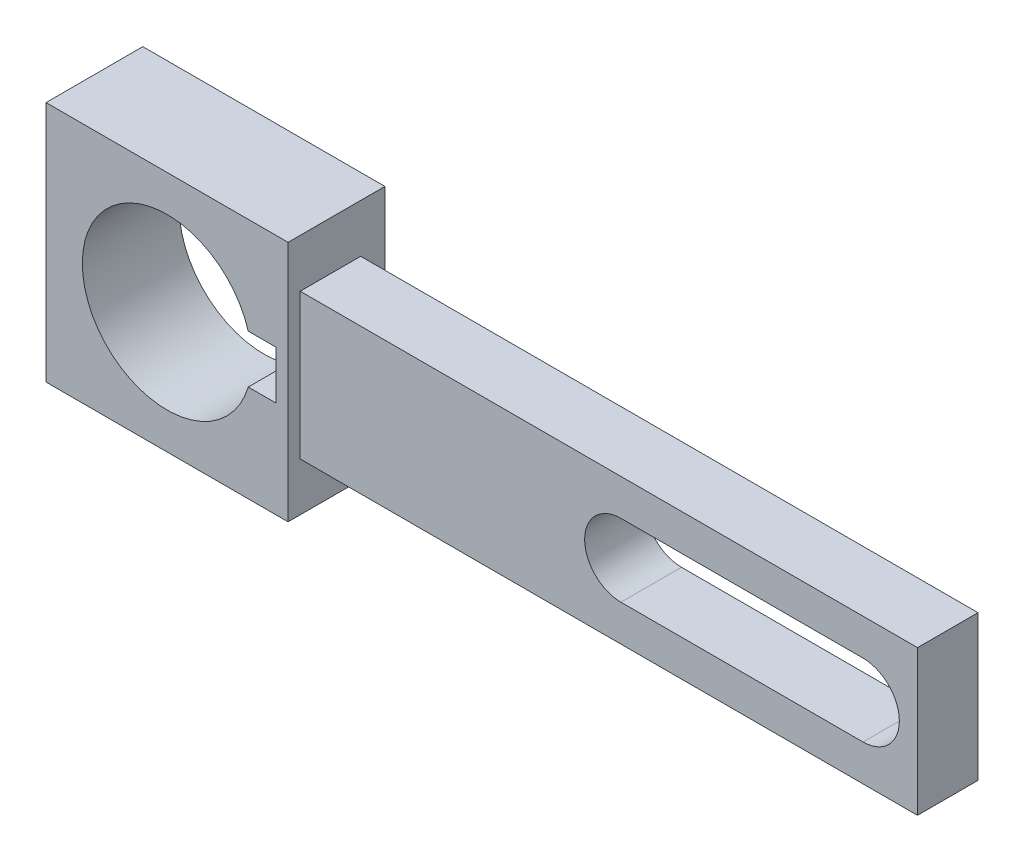
ISO-10303-21;
HEADER;
FILE_DESCRIPTION(('STEP AP214'),'2;1');
FILE_NAME('part.step','',(''),(''),'','','');
FILE_SCHEMA(('AUTOMOTIVE_DESIGN { 1 0 10303 214 1 1 1 1 }'));
ENDSEC;
DATA;
#1=APPLICATION_CONTEXT('core data for automotive mechanical design processes');
#2=APPLICATION_PROTOCOL_DEFINITION('international standard','automotive_design',2000,#1);
#3=PRODUCT_CONTEXT('',#1,'mechanical');
#4=PRODUCT('Part','Part','',(#3));
#5=PRODUCT_RELATED_PRODUCT_CATEGORY('part','',(#4));
#6=PRODUCT_DEFINITION_FORMATION('','',#4);
#7=PRODUCT_DEFINITION_CONTEXT('part definition',#1,'design');
#8=PRODUCT_DEFINITION('design','',#6,#7);
#9=PRODUCT_DEFINITION_SHAPE('','',#8);
#10=(LENGTH_UNIT() NAMED_UNIT(*) SI_UNIT(.MILLI.,.METRE.));
#11=(NAMED_UNIT(*) PLANE_ANGLE_UNIT() SI_UNIT($,.RADIAN.));
#12=(NAMED_UNIT(*) SI_UNIT($,.STERADIAN.) SOLID_ANGLE_UNIT());
#13=UNCERTAINTY_MEASURE_WITH_UNIT(LENGTH_MEASURE(1.E-05),#10,'distance_accuracy_value','');
#14=(GEOMETRIC_REPRESENTATION_CONTEXT(3) GLOBAL_UNCERTAINTY_ASSIGNED_CONTEXT((#13)) GLOBAL_UNIT_ASSIGNED_CONTEXT((#10,
#11,#12)) REPRESENTATION_CONTEXT('',''));
#15=CARTESIAN_POINT('',(0.,0.,0.));
#16=DIRECTION('',(0.,0.,1.));
#17=DIRECTION('',(1.,0.,0.));
#18=AXIS2_PLACEMENT_3D('',#15,#16,#17);
#19=CARTESIAN_POINT('',(10.,-10.,8.));
#20=DIRECTION('',(-1.,0.,0.));
#21=DIRECTION('',(0.,0.,1.));
#22=AXIS2_PLACEMENT_3D('',#19,#20,#21);
#23=PLANE('',#22);
#24=DIRECTION('',(0.,1.,0.));
#25=VECTOR('',#24,1.);
#26=CARTESIAN_POINT('',(10.,-10.,0.));
#27=LINE('',#26,#25);
#28=CARTESIAN_POINT('',(10.,-10.,0.));
#29=VERTEX_POINT('',#28);
#30=CARTESIAN_POINT('',(10.,10.,0.));
#31=VERTEX_POINT('',#30);
#32=EDGE_CURVE('E288',#29,#31,#27,.T.);
#33=ORIENTED_EDGE('',*,*,#32,.T.);
#34=DIRECTION('',(0.,0.,-1.));
#35=VECTOR('',#34,1.);
#36=CARTESIAN_POINT('',(10.,10.,8.));
#37=LINE('',#36,#35);
#38=CARTESIAN_POINT('',(10.,10.,8.));
#39=VERTEX_POINT('',#38);
#40=EDGE_CURVE('E11',#39,#31,#37,.T.);
#41=ORIENTED_EDGE('',*,*,#40,.F.);
#42=DIRECTION('',(0.,1.,0.));
#43=VECTOR('',#42,1.);
#44=CARTESIAN_POINT('',(10.,-10.,8.));
#45=LINE('',#44,#43);
#46=CARTESIAN_POINT('',(10.,-10.,8.));
#47=VERTEX_POINT('',#46);
#48=EDGE_CURVE('E289',#47,#39,#45,.T.);
#49=ORIENTED_EDGE('',*,*,#48,.F.);
#50=DIRECTION('',(0.,0.,-1.));
#51=VECTOR('',#50,1.);
#52=CARTESIAN_POINT('',(10.,-10.,8.));
#53=LINE('',#52,#51);
#54=EDGE_CURVE('E303',#47,#29,#53,.T.);
#55=ORIENTED_EDGE('',*,*,#54,.T.);
#56=EDGE_LOOP('',(#33,#41,#49,#55));
#57=FACE_BOUND('',#56,.T.);
#58=DIRECTION('',(0.,-1.,0.));
#59=VECTOR('',#58,1.);
#60=CARTESIAN_POINT('',(10.,6.,7.));
#61=LINE('',#60,#59);
#62=CARTESIAN_POINT('',(10.,6.,7.));
#63=VERTEX_POINT('',#62);
#64=CARTESIAN_POINT('',(10.,-6.,7.));
#65=VERTEX_POINT('',#64);
#66=EDGE_CURVE('E200',#63,#65,#61,.T.);
#67=ORIENTED_EDGE('',*,*,#66,.F.);
#68=DIRECTION('',(0.,0.,1.));
#69=VECTOR('',#68,1.);
#70=CARTESIAN_POINT('',(10.,6.,7.));
#71=LINE('',#70,#69);
#72=CARTESIAN_POINT('',(10.,6.,2.));
#73=VERTEX_POINT('',#72);
#74=EDGE_CURVE('E206',#73,#63,#71,.T.);
#75=ORIENTED_EDGE('',*,*,#74,.F.);
#76=DIRECTION('',(0.,1.,0.));
#77=VECTOR('',#76,1.);
#78=CARTESIAN_POINT('',(10.,6.,2.));
#79=LINE('',#78,#77);
#80=CARTESIAN_POINT('',(10.,-6.,2.));
#81=VERTEX_POINT('',#80);
#82=EDGE_CURVE('E223',#81,#73,#79,.T.);
#83=ORIENTED_EDGE('',*,*,#82,.F.);
#84=DIRECTION('',(0.,0.,-1.));
#85=VECTOR('',#84,1.);
#86=CARTESIAN_POINT('',(10.,-6.,7.));
#87=LINE('',#86,#85);
#88=EDGE_CURVE('E219',#65,#81,#87,.T.);
#89=ORIENTED_EDGE('',*,*,#88,.F.);
#90=EDGE_LOOP('',(#67,#75,#83,#89));
#91=FACE_BOUND('',#90,.T.);
#92=ADVANCED_FACE('F39',(#57,#91),#23,.F.);
#93=CARTESIAN_POINT('',(0.,0.,8.));
#94=DIRECTION('',(0.,0.,-1.));
#95=DIRECTION('',(-1.,0.,0.));
#96=AXIS2_PLACEMENT_3D('',#93,#94,#95);
#97=PLANE('',#96);
#98=ORIENTED_EDGE('',*,*,#48,.T.);
#99=DIRECTION('',(-1.,0.,0.));
#100=VECTOR('',#99,1.);
#101=CARTESIAN_POINT('',(-10.,10.,8.));
#102=LINE('',#101,#100);
#103=CARTESIAN_POINT('',(-10.,10.,8.));
#104=VERTEX_POINT('',#103);
#105=EDGE_CURVE('E293',#39,#104,#102,.T.);
#106=ORIENTED_EDGE('',*,*,#105,.T.);
#107=DIRECTION('',(0.,-1.,0.));
#108=VECTOR('',#107,1.);
#109=CARTESIAN_POINT('',(-10.,-10.,8.));
#110=LINE('',#109,#108);
#111=CARTESIAN_POINT('',(-10.,-10.,8.));
#112=VERTEX_POINT('',#111);
#113=EDGE_CURVE('E297',#104,#112,#110,.T.);
#114=ORIENTED_EDGE('',*,*,#113,.T.);
#115=DIRECTION('',(1.,0.,0.));
#116=VECTOR('',#115,1.);
#117=CARTESIAN_POINT('',(-10.,-10.,8.));
#118=LINE('',#117,#116);
#119=EDGE_CURVE('E300',#112,#47,#118,.T.);
#120=ORIENTED_EDGE('',*,*,#119,.T.);
#121=EDGE_LOOP('',(#98,#106,#114,#120));
#122=FACE_BOUND('',#121,.T.);
#123=DIRECTION('',(0.,1.,0.));
#124=VECTOR('',#123,1.);
#125=CARTESIAN_POINT('',(9.,-2.,8.));
#126=LINE('',#125,#124);
#127=CARTESIAN_POINT('',(9.,-2.,8.));
#128=VERTEX_POINT('',#127);
#129=CARTESIAN_POINT('',(9.,2.,8.));
#130=VERTEX_POINT('',#129);
#131=EDGE_CURVE('E246',#128,#130,#126,.T.);
#132=ORIENTED_EDGE('',*,*,#131,.F.);
#133=DIRECTION('',(1.,0.,0.));
#134=VECTOR('',#133,1.);
#135=CARTESIAN_POINT('',(6.70820393249936,-2.00000000000002,8.));
#136=LINE('',#135,#134);
#137=CARTESIAN_POINT('',(6.70820393249936,-2.00000000000002,8.));
#138=VERTEX_POINT('',#137);
#139=EDGE_CURVE('E257',#138,#128,#136,.T.);
#140=ORIENTED_EDGE('',*,*,#139,.F.);
#141=CARTESIAN_POINT('',(0.,0.,8.));
#142=DIRECTION('',(0.,0.,1.));
#143=DIRECTION('',(1.,0.,0.));
#144=AXIS2_PLACEMENT_3D('',#141,#142,#143);
#145=CIRCLE('',#144,7.);
#146=CARTESIAN_POINT('',(6.70820393249937,1.99999999999998,8.));
#147=VERTEX_POINT('',#146);
#148=EDGE_CURVE('E253',#147,#138,#145,.T.);
#149=ORIENTED_EDGE('',*,*,#148,.F.);
#150=DIRECTION('',(-1.,0.,0.));
#151=VECTOR('',#150,1.);
#152=CARTESIAN_POINT('',(6.70820393249937,1.99999999999998,8.));
#153=LINE('',#152,#151);
#154=EDGE_CURVE('E249',#130,#147,#153,.T.);
#155=ORIENTED_EDGE('',*,*,#154,.F.);
#156=EDGE_LOOP('',(#132,#140,#149,#155));
#157=FACE_BOUND('',#156,.T.);
#158=ADVANCED_FACE('F344',(#122,#157),#97,.F.);
#159=CARTESIAN_POINT('',(0.,0.,0.));
#160=DIRECTION('',(0.,0.,-1.));
#161=DIRECTION('',(-1.,0.,0.));
#162=AXIS2_PLACEMENT_3D('',#159,#160,#161);
#163=PLANE('',#162);
#164=ORIENTED_EDGE('',*,*,#32,.F.);
#165=DIRECTION('',(1.,0.,0.));
#166=VECTOR('',#165,1.);
#167=CARTESIAN_POINT('',(-10.,-10.,0.));
#168=LINE('',#167,#166);
#169=CARTESIAN_POINT('',(-10.,-10.,0.));
#170=VERTEX_POINT('',#169);
#171=EDGE_CURVE('E294',#170,#29,#168,.T.);
#172=ORIENTED_EDGE('',*,*,#171,.F.);
#173=DIRECTION('',(0.,-1.,0.));
#174=VECTOR('',#173,1.);
#175=CARTESIAN_POINT('',(-10.,-10.,0.));
#176=LINE('',#175,#174);
#177=CARTESIAN_POINT('',(-10.,10.,0.));
#178=VERTEX_POINT('',#177);
#179=EDGE_CURVE('E310',#178,#170,#176,.T.);
#180=ORIENTED_EDGE('',*,*,#179,.F.);
#181=DIRECTION('',(-1.,0.,0.));
#182=VECTOR('',#181,1.);
#183=CARTESIAN_POINT('',(-10.,10.,0.));
#184=LINE('',#183,#182);
#185=EDGE_CURVE('E307',#31,#178,#184,.T.);
#186=ORIENTED_EDGE('',*,*,#185,.F.);
#187=EDGE_LOOP('',(#164,#172,#180,#186));
#188=FACE_BOUND('',#187,.T.);
#189=DIRECTION('',(1.,0.,0.));
#190=VECTOR('',#189,1.);
#191=CARTESIAN_POINT('',(6.70820393249936,-2.00000000000002,0.));
#192=LINE('',#191,#190);
#193=CARTESIAN_POINT('',(6.70820393249936,-2.00000000000002,0.));
#194=VERTEX_POINT('',#193);
#195=CARTESIAN_POINT('',(9.,-2.,0.));
#196=VERTEX_POINT('',#195);
#197=EDGE_CURVE('E250',#194,#196,#192,.T.);
#198=ORIENTED_EDGE('',*,*,#197,.T.);
#199=DIRECTION('',(0.,1.,0.));
#200=VECTOR('',#199,1.);
#201=CARTESIAN_POINT('',(9.,-2.,0.));
#202=LINE('',#201,#200);
#203=CARTESIAN_POINT('',(9.,2.,0.));
#204=VERTEX_POINT('',#203);
#205=EDGE_CURVE('E245',#196,#204,#202,.T.);
#206=ORIENTED_EDGE('',*,*,#205,.T.);
#207=DIRECTION('',(-1.,0.,0.));
#208=VECTOR('',#207,1.);
#209=CARTESIAN_POINT('',(6.70820393249937,1.99999999999998,0.));
#210=LINE('',#209,#208);
#211=CARTESIAN_POINT('',(6.70820393249937,1.99999999999998,0.));
#212=VERTEX_POINT('',#211);
#213=EDGE_CURVE('E264',#204,#212,#210,.T.);
#214=ORIENTED_EDGE('',*,*,#213,.T.);
#215=CARTESIAN_POINT('',(0.,0.,0.));
#216=DIRECTION('',(0.,0.,1.));
#217=DIRECTION('',(1.,0.,0.));
#218=AXIS2_PLACEMENT_3D('',#215,#216,#217);
#219=CIRCLE('',#218,7.);
#220=EDGE_CURVE('E268',#212,#194,#219,.T.);
#221=ORIENTED_EDGE('',*,*,#220,.T.);
#222=EDGE_LOOP('',(#198,#206,#214,#221));
#223=FACE_BOUND('',#222,.T.);
#224=ADVANCED_FACE('F333',(#188,#223),#163,.T.);
#225=CARTESIAN_POINT('',(-10.,10.,8.));
#226=DIRECTION('',(0.,-1.,0.));
#227=DIRECTION('',(0.,0.,-1.));
#228=AXIS2_PLACEMENT_3D('',#225,#226,#227);
#229=PLANE('',#228);
#230=ORIENTED_EDGE('',*,*,#185,.T.);
#231=DIRECTION('',(0.,0.,-1.));
#232=VECTOR('',#231,1.);
#233=CARTESIAN_POINT('',(-10.,10.,8.));
#234=LINE('',#233,#232);
#235=EDGE_CURVE('E47',#104,#178,#234,.T.);
#236=ORIENTED_EDGE('',*,*,#235,.F.);
#237=ORIENTED_EDGE('',*,*,#105,.F.);
#238=ORIENTED_EDGE('',*,*,#40,.T.);
#239=EDGE_LOOP('',(#230,#236,#237,#238));
#240=FACE_BOUND('',#239,.T.);
#241=ADVANCED_FACE('F346',(#240),#229,.F.);
#242=CARTESIAN_POINT('',(-10.,-10.,8.));
#243=DIRECTION('',(1.,0.,0.));
#244=DIRECTION('',(0.,0.,-1.));
#245=AXIS2_PLACEMENT_3D('',#242,#243,#244);
#246=PLANE('',#245);
#247=ORIENTED_EDGE('',*,*,#179,.T.);
#248=DIRECTION('',(0.,0.,-1.));
#249=VECTOR('',#248,1.);
#250=CARTESIAN_POINT('',(-10.,-10.,8.));
#251=LINE('',#250,#249);
#252=EDGE_CURVE('E318',#112,#170,#251,.T.);
#253=ORIENTED_EDGE('',*,*,#252,.F.);
#254=ORIENTED_EDGE('',*,*,#113,.F.);
#255=ORIENTED_EDGE('',*,*,#235,.T.);
#256=EDGE_LOOP('',(#247,#253,#254,#255));
#257=FACE_BOUND('',#256,.T.);
#258=ADVANCED_FACE('F327',(#257),#246,.F.);
#259=CARTESIAN_POINT('',(-10.,-10.,8.));
#260=DIRECTION('',(0.,1.,0.));
#261=DIRECTION('',(0.,0.,1.));
#262=AXIS2_PLACEMENT_3D('',#259,#260,#261);
#263=PLANE('',#262);
#264=ORIENTED_EDGE('',*,*,#171,.T.);
#265=ORIENTED_EDGE('',*,*,#54,.F.);
#266=ORIENTED_EDGE('',*,*,#119,.F.);
#267=ORIENTED_EDGE('',*,*,#252,.T.);
#268=EDGE_LOOP('',(#264,#265,#266,#267));
#269=FACE_BOUND('',#268,.T.);
#270=ADVANCED_FACE('F337',(#269),#263,.F.);
#271=CARTESIAN_POINT('',(9.,-2.,8.));
#272=DIRECTION('',(-1.,0.,0.));
#273=DIRECTION('',(0.,-1.,0.));
#274=AXIS2_PLACEMENT_3D('',#271,#272,#273);
#275=PLANE('',#274);
#276=ORIENTED_EDGE('',*,*,#205,.F.);
#277=DIRECTION('',(0.,0.,-1.));
#278=VECTOR('',#277,1.);
#279=CARTESIAN_POINT('',(9.,-2.,8.));
#280=LINE('',#279,#278);
#281=EDGE_CURVE('E260',#128,#196,#280,.T.);
#282=ORIENTED_EDGE('',*,*,#281,.F.);
#283=ORIENTED_EDGE('',*,*,#131,.T.);
#284=DIRECTION('',(0.,0.,-1.));
#285=VECTOR('',#284,1.);
#286=CARTESIAN_POINT('',(9.,2.,8.));
#287=LINE('',#286,#285);
#288=EDGE_CURVE('E284',#130,#204,#287,.T.);
#289=ORIENTED_EDGE('',*,*,#288,.T.);
#290=EDGE_LOOP('',(#276,#282,#283,#289));
#291=FACE_BOUND('',#290,.T.);
#292=ADVANCED_FACE('F362',(#291),#275,.T.);
#293=CARTESIAN_POINT('',(6.70820393249937,1.99999999999998,8.));
#294=DIRECTION('',(0.,-1.,0.));
#295=DIRECTION('',(1.,0.,0.));
#296=AXIS2_PLACEMENT_3D('',#293,#294,#295);
#297=PLANE('',#296);
#298=ORIENTED_EDGE('',*,*,#213,.F.);
#299=ORIENTED_EDGE('',*,*,#288,.F.);
#300=ORIENTED_EDGE('',*,*,#154,.T.);
#301=DIRECTION('',(0.,0.,-1.));
#302=VECTOR('',#301,1.);
#303=CARTESIAN_POINT('',(6.70820393249937,1.99999999999998,8.));
#304=LINE('',#303,#302);
#305=EDGE_CURVE('E281',#147,#212,#304,.T.);
#306=ORIENTED_EDGE('',*,*,#305,.T.);
#307=EDGE_LOOP('',(#298,#299,#300,#306));
#308=FACE_BOUND('',#307,.T.);
#309=ADVANCED_FACE('F369',(#308),#297,.T.);
#310=CARTESIAN_POINT('',(0.,0.,8.));
#311=DIRECTION('',(0.,0.,-1.));
#312=DIRECTION('',(-1.,0.,0.));
#313=AXIS2_PLACEMENT_3D('',#310,#311,#312);
#314=CYLINDRICAL_SURFACE('',#313,7.);
#315=ORIENTED_EDGE('',*,*,#220,.F.);
#316=ORIENTED_EDGE('',*,*,#305,.F.);
#317=ORIENTED_EDGE('',*,*,#148,.T.);
#318=DIRECTION('',(0.,0.,-1.));
#319=VECTOR('',#318,1.);
#320=CARTESIAN_POINT('',(6.70820393249936,-2.00000000000002,8.));
#321=LINE('',#320,#319);
#322=EDGE_CURVE('E278',#138,#194,#321,.T.);
#323=ORIENTED_EDGE('',*,*,#322,.T.);
#324=EDGE_LOOP('',(#315,#316,#317,#323));
#325=FACE_BOUND('',#324,.T.);
#326=ADVANCED_FACE('F374',(#325),#314,.F.);
#327=CARTESIAN_POINT('',(6.70820393249936,-2.00000000000002,8.));
#328=DIRECTION('',(0.,1.,0.));
#329=DIRECTION('',(-1.,0.,0.));
#330=AXIS2_PLACEMENT_3D('',#327,#328,#329);
#331=PLANE('',#330);
#332=ORIENTED_EDGE('',*,*,#197,.F.);
#333=ORIENTED_EDGE('',*,*,#322,.F.);
#334=ORIENTED_EDGE('',*,*,#139,.T.);
#335=ORIENTED_EDGE('',*,*,#281,.T.);
#336=EDGE_LOOP('',(#332,#333,#334,#335));
#337=FACE_BOUND('',#336,.T.);
#338=ADVANCED_FACE('F381',(#337),#331,.T.);
#339=CARTESIAN_POINT('',(61.,6.,7.));
#340=DIRECTION('',(0.,0.,-1.));
#341=DIRECTION('',(-1.,0.,0.));
#342=AXIS2_PLACEMENT_3D('',#339,#340,#341);
#343=PLANE('',#342);
#344=DIRECTION('',(1.,0.,0.));
#345=VECTOR('',#344,1.);
#346=CARTESIAN_POINT('',(61.,3.,7.));
#347=LINE('',#346,#345);
#348=CARTESIAN_POINT('',(36.5,3.,7.));
#349=VERTEX_POINT('',#348);
#350=CARTESIAN_POINT('',(56.5,3.,7.));
#351=VERTEX_POINT('',#350);
#352=EDGE_CURVE('E192',#349,#351,#347,.T.);
#353=ORIENTED_EDGE('',*,*,#352,.T.);
#354=CARTESIAN_POINT('',(56.5,0.,7.));
#355=DIRECTION('',(0.,0.,-1.));
#356=DIRECTION('',(-1.,0.,0.));
#357=AXIS2_PLACEMENT_3D('',#354,#355,#356);
#358=CIRCLE('',#357,3.);
#359=CARTESIAN_POINT('',(56.5,-3.,7.));
#360=VERTEX_POINT('',#359);
#361=EDGE_CURVE('E196',#351,#360,#358,.T.);
#362=ORIENTED_EDGE('',*,*,#361,.T.);
#363=DIRECTION('',(-1.,0.,0.));
#364=VECTOR('',#363,1.);
#365=CARTESIAN_POINT('',(61.,-3.,7.));
#366=LINE('',#365,#364);
#367=CARTESIAN_POINT('',(36.5,-3.,7.));
#368=VERTEX_POINT('',#367);
#369=EDGE_CURVE('E183',#360,#368,#366,.T.);
#370=ORIENTED_EDGE('',*,*,#369,.T.);
#371=CARTESIAN_POINT('',(36.5,0.,7.));
#372=DIRECTION('',(0.,0.,-1.));
#373=DIRECTION('',(-1.,0.,0.));
#374=AXIS2_PLACEMENT_3D('',#371,#372,#373);
#375=CIRCLE('',#374,3.);
#376=EDGE_CURVE('E158',#368,#349,#375,.T.);
#377=ORIENTED_EDGE('',*,*,#376,.T.);
#378=EDGE_LOOP('',(#353,#362,#370,#377));
#379=FACE_BOUND('',#378,.T.);
#380=ORIENTED_EDGE('',*,*,#66,.T.);
#381=DIRECTION('',(-1.,0.,0.));
#382=VECTOR('',#381,1.);
#383=CARTESIAN_POINT('',(61.,-6.,7.));
#384=LINE('',#383,#382);
#385=CARTESIAN_POINT('',(61.,-6.,7.));
#386=VERTEX_POINT('',#385);
#387=EDGE_CURVE('E241',#386,#65,#384,.T.);
#388=ORIENTED_EDGE('',*,*,#387,.F.);
#389=DIRECTION('',(0.,-1.,0.));
#390=VECTOR('',#389,1.);
#391=CARTESIAN_POINT('',(61.,6.,7.));
#392=LINE('',#391,#390);
#393=CARTESIAN_POINT('',(61.,6.,7.));
#394=VERTEX_POINT('',#393);
#395=EDGE_CURVE('E201',#394,#386,#392,.T.);
#396=ORIENTED_EDGE('',*,*,#395,.F.);
#397=DIRECTION('',(-1.,0.,0.));
#398=VECTOR('',#397,1.);
#399=CARTESIAN_POINT('',(61.,6.,7.));
#400=LINE('',#399,#398);
#401=EDGE_CURVE('E215',#394,#63,#400,.T.);
#402=ORIENTED_EDGE('',*,*,#401,.T.);
#403=EDGE_LOOP('',(#380,#388,#396,#402));
#404=FACE_BOUND('',#403,.T.);
#405=ADVANCED_FACE('F393',(#379,#404),#343,.F.);
#406=CARTESIAN_POINT('',(61.,-6.,7.));
#407=DIRECTION('',(0.,1.,0.));
#408=DIRECTION('',(0.,0.,1.));
#409=AXIS2_PLACEMENT_3D('',#406,#407,#408);
#410=PLANE('',#409);
#411=ORIENTED_EDGE('',*,*,#88,.T.);
#412=DIRECTION('',(-1.,0.,0.));
#413=VECTOR('',#412,1.);
#414=CARTESIAN_POINT('',(61.,-6.,2.));
#415=LINE('',#414,#413);
#416=CARTESIAN_POINT('',(61.,-6.,2.));
#417=VERTEX_POINT('',#416);
#418=EDGE_CURVE('E237',#417,#81,#415,.T.);
#419=ORIENTED_EDGE('',*,*,#418,.F.);
#420=DIRECTION('',(0.,0.,-1.));
#421=VECTOR('',#420,1.);
#422=CARTESIAN_POINT('',(61.,-6.,7.));
#423=LINE('',#422,#421);
#424=EDGE_CURVE('E205',#386,#417,#423,.T.);
#425=ORIENTED_EDGE('',*,*,#424,.F.);
#426=ORIENTED_EDGE('',*,*,#387,.T.);
#427=EDGE_LOOP('',(#411,#419,#425,#426));
#428=FACE_BOUND('',#427,.T.);
#429=ADVANCED_FACE('F398',(#428),#410,.F.);
#430=CARTESIAN_POINT('',(61.,6.,2.));
#431=DIRECTION('',(0.,0.,1.));
#432=DIRECTION('',(1.,0.,0.));
#433=AXIS2_PLACEMENT_3D('',#430,#431,#432);
#434=PLANE('',#433);
#435=DIRECTION('',(-1.,0.,0.));
#436=VECTOR('',#435,1.);
#437=CARTESIAN_POINT('',(56.5,-3.,2.));
#438=LINE('',#437,#436);
#439=CARTESIAN_POINT('',(56.5,-3.,2.));
#440=VERTEX_POINT('',#439);
#441=CARTESIAN_POINT('',(36.5,-3.,2.));
#442=VERTEX_POINT('',#441);
#443=EDGE_CURVE('E165',#440,#442,#438,.T.);
#444=ORIENTED_EDGE('',*,*,#443,.F.);
#445=CARTESIAN_POINT('',(56.5,0.,2.));
#446=DIRECTION('',(0.,0.,-1.));
#447=DIRECTION('',(-1.,0.,0.));
#448=AXIS2_PLACEMENT_3D('',#445,#446,#447);
#449=CIRCLE('',#448,3.);
#450=CARTESIAN_POINT('',(56.5,3.,2.));
#451=VERTEX_POINT('',#450);
#452=EDGE_CURVE('E62',#451,#440,#449,.T.);
#453=ORIENTED_EDGE('',*,*,#452,.F.);
#454=DIRECTION('',(1.,0.,0.));
#455=VECTOR('',#454,1.);
#456=CARTESIAN_POINT('',(56.5,3.,2.));
#457=LINE('',#456,#455);
#458=CARTESIAN_POINT('',(36.5,3.,2.));
#459=VERTEX_POINT('',#458);
#460=EDGE_CURVE('E173',#459,#451,#457,.T.);
#461=ORIENTED_EDGE('',*,*,#460,.F.);
#462=CARTESIAN_POINT('',(36.5,0.,2.));
#463=DIRECTION('',(0.,0.,-1.));
#464=DIRECTION('',(-1.,0.,0.));
#465=AXIS2_PLACEMENT_3D('',#462,#463,#464);
#466=CIRCLE('',#465,3.);
#467=EDGE_CURVE('E155',#442,#459,#466,.T.);
#468=ORIENTED_EDGE('',*,*,#467,.F.);
#469=EDGE_LOOP('',(#444,#453,#461,#468));
#470=FACE_BOUND('',#469,.T.);
#471=ORIENTED_EDGE('',*,*,#82,.T.);
#472=DIRECTION('',(-1.,0.,0.));
#473=VECTOR('',#472,1.);
#474=CARTESIAN_POINT('',(61.,6.,2.));
#475=LINE('',#474,#473);
#476=CARTESIAN_POINT('',(61.,6.,2.));
#477=VERTEX_POINT('',#476);
#478=EDGE_CURVE('E233',#477,#73,#475,.T.);
#479=ORIENTED_EDGE('',*,*,#478,.F.);
#480=DIRECTION('',(0.,1.,0.));
#481=VECTOR('',#480,1.);
#482=CARTESIAN_POINT('',(61.,6.,2.));
#483=LINE('',#482,#481);
#484=EDGE_CURVE('E209',#417,#477,#483,.T.);
#485=ORIENTED_EDGE('',*,*,#484,.F.);
#486=ORIENTED_EDGE('',*,*,#418,.T.);
#487=EDGE_LOOP('',(#471,#479,#485,#486));
#488=FACE_BOUND('',#487,.T.);
#489=ADVANCED_FACE('F170',(#470,#488),#434,.F.);
#490=CARTESIAN_POINT('',(61.,6.,7.));
#491=DIRECTION('',(0.,-1.,0.));
#492=DIRECTION('',(0.,0.,-1.));
#493=AXIS2_PLACEMENT_3D('',#490,#491,#492);
#494=PLANE('',#493);
#495=ORIENTED_EDGE('',*,*,#74,.T.);
#496=ORIENTED_EDGE('',*,*,#401,.F.);
#497=DIRECTION('',(0.,0.,1.));
#498=VECTOR('',#497,1.);
#499=CARTESIAN_POINT('',(61.,6.,7.));
#500=LINE('',#499,#498);
#501=EDGE_CURVE('E212',#477,#394,#500,.T.);
#502=ORIENTED_EDGE('',*,*,#501,.F.);
#503=ORIENTED_EDGE('',*,*,#478,.T.);
#504=EDGE_LOOP('',(#495,#496,#502,#503));
#505=FACE_BOUND('',#504,.T.);
#506=ADVANCED_FACE('F405',(#505),#494,.F.);
#507=CARTESIAN_POINT('',(61.,0.,0.));
#508=DIRECTION('',(1.,0.,0.));
#509=DIRECTION('',(0.,0.,-1.));
#510=AXIS2_PLACEMENT_3D('',#507,#508,#509);
#511=PLANE('',#510);
#512=ORIENTED_EDGE('',*,*,#395,.T.);
#513=ORIENTED_EDGE('',*,*,#424,.T.);
#514=ORIENTED_EDGE('',*,*,#484,.T.);
#515=ORIENTED_EDGE('',*,*,#501,.T.);
#516=EDGE_LOOP('',(#512,#513,#514,#515));
#517=FACE_BOUND('',#516,.T.);
#518=ADVANCED_FACE('F408',(#517),#511,.T.);
#519=CARTESIAN_POINT('',(56.5,0.,8.));
#520=DIRECTION('',(0.,0.,-1.));
#521=DIRECTION('',(-1.,0.,0.));
#522=AXIS2_PLACEMENT_3D('',#519,#520,#521);
#523=CYLINDRICAL_SURFACE('',#522,3.);
#524=DIRECTION('',(0.,0.,-1.));
#525=VECTOR('',#524,1.);
#526=CARTESIAN_POINT('',(56.5,3.,8.));
#527=LINE('',#526,#525);
#528=EDGE_CURVE('E180',#351,#451,#527,.T.);
#529=ORIENTED_EDGE('',*,*,#528,.T.);
#530=ORIENTED_EDGE('',*,*,#452,.T.);
#531=DIRECTION('',(0.,0.,-1.));
#532=VECTOR('',#531,1.);
#533=CARTESIAN_POINT('',(56.5,-3.,8.));
#534=LINE('',#533,#532);
#535=EDGE_CURVE('E162',#360,#440,#534,.T.);
#536=ORIENTED_EDGE('',*,*,#535,.F.);
#537=ORIENTED_EDGE('',*,*,#361,.F.);
#538=EDGE_LOOP('',(#529,#530,#536,#537));
#539=FACE_BOUND('',#538,.T.);
#540=ADVANCED_FACE('F412',(#539),#523,.F.);
#541=CARTESIAN_POINT('',(56.5,3.,8.));
#542=DIRECTION('',(0.,1.,0.));
#543=DIRECTION('',(0.,0.,1.));
#544=AXIS2_PLACEMENT_3D('',#541,#542,#543);
#545=PLANE('',#544);
#546=DIRECTION('',(0.,0.,-1.));
#547=VECTOR('',#546,1.);
#548=CARTESIAN_POINT('',(36.5,3.,8.));
#549=LINE('',#548,#547);
#550=EDGE_CURVE('E161',#349,#459,#549,.T.);
#551=ORIENTED_EDGE('',*,*,#550,.T.);
#552=ORIENTED_EDGE('',*,*,#460,.T.);
#553=ORIENTED_EDGE('',*,*,#528,.F.);
#554=ORIENTED_EDGE('',*,*,#352,.F.);
#555=EDGE_LOOP('',(#551,#552,#553,#554));
#556=FACE_BOUND('',#555,.T.);
#557=ADVANCED_FACE('F416',(#556),#545,.F.);
#558=CARTESIAN_POINT('',(36.5,0.,8.));
#559=DIRECTION('',(0.,0.,-1.));
#560=DIRECTION('',(-1.,0.,0.));
#561=AXIS2_PLACEMENT_3D('',#558,#559,#560);
#562=CYLINDRICAL_SURFACE('',#561,3.);
#563=DIRECTION('',(0.,0.,-1.));
#564=VECTOR('',#563,1.);
#565=CARTESIAN_POINT('',(36.5,-3.,8.));
#566=LINE('',#565,#564);
#567=EDGE_CURVE('E54',#368,#442,#566,.T.);
#568=ORIENTED_EDGE('',*,*,#567,.T.);
#569=ORIENTED_EDGE('',*,*,#467,.T.);
#570=ORIENTED_EDGE('',*,*,#550,.F.);
#571=ORIENTED_EDGE('',*,*,#376,.F.);
#572=EDGE_LOOP('',(#568,#569,#570,#571));
#573=FACE_BOUND('',#572,.T.);
#574=ADVANCED_FACE('F152',(#573),#562,.F.);
#575=CARTESIAN_POINT('',(56.5,-3.,8.));
#576=DIRECTION('',(0.,-1.,0.));
#577=DIRECTION('',(0.,0.,-1.));
#578=AXIS2_PLACEMENT_3D('',#575,#576,#577);
#579=PLANE('',#578);
#580=ORIENTED_EDGE('',*,*,#535,.T.);
#581=ORIENTED_EDGE('',*,*,#443,.T.);
#582=ORIENTED_EDGE('',*,*,#567,.F.);
#583=ORIENTED_EDGE('',*,*,#369,.F.);
#584=EDGE_LOOP('',(#580,#581,#582,#583));
#585=FACE_BOUND('',#584,.T.);
#586=ADVANCED_FACE('F166',(#585),#579,.F.);
#587=CLOSED_SHELL('',(#92,#158,#224,#241,#258,#270,#292,#309,#326,#338,#405,#429,#489,#506,#518,
#540,#557,#574,#586));
#588=MANIFOLD_SOLID_BREP('B2',#587);
#589=ADVANCED_BREP_SHAPE_REPRESENTATION('',(#18,#588),#14);
#590=SHAPE_DEFINITION_REPRESENTATION(#9,#589);
ENDSEC;
END-ISO-10303-21;
